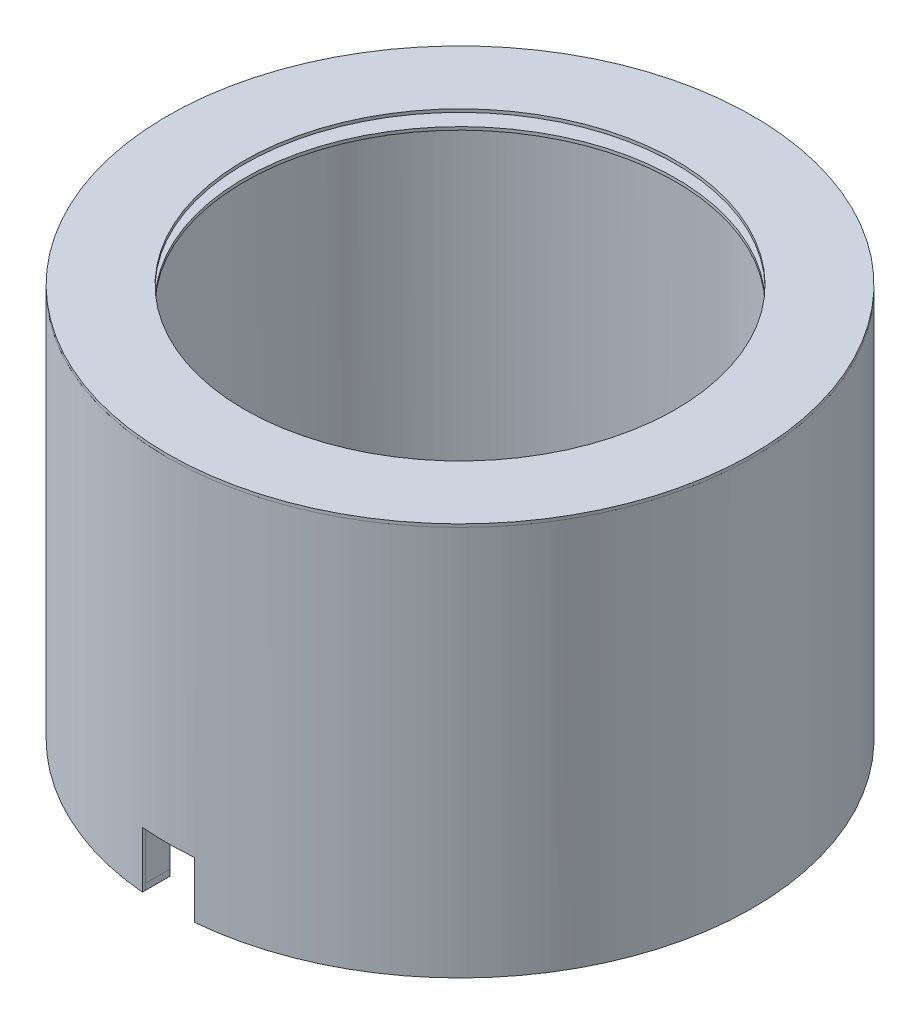
ISO-10303-21;
HEADER;
FILE_DESCRIPTION(('STEP AP214'),'2;1');
FILE_NAME('part.step','',(''),(''),'','','');
FILE_SCHEMA(('AUTOMOTIVE_DESIGN { 1 0 10303 214 1 1 1 1 }'));
ENDSEC;
DATA;
#1=APPLICATION_CONTEXT('core data for automotive mechanical design processes');
#2=APPLICATION_PROTOCOL_DEFINITION('international standard','automotive_design',2000,#1);
#3=PRODUCT_CONTEXT('',#1,'mechanical');
#4=PRODUCT('Part','Part','',(#3));
#5=PRODUCT_RELATED_PRODUCT_CATEGORY('part','',(#4));
#6=PRODUCT_DEFINITION_FORMATION('','',#4);
#7=PRODUCT_DEFINITION_CONTEXT('part definition',#1,'design');
#8=PRODUCT_DEFINITION('design','',#6,#7);
#9=PRODUCT_DEFINITION_SHAPE('','',#8);
#10=(LENGTH_UNIT() NAMED_UNIT(*) SI_UNIT(.MILLI.,.METRE.));
#11=(NAMED_UNIT(*) PLANE_ANGLE_UNIT() SI_UNIT($,.RADIAN.));
#12=(NAMED_UNIT(*) SI_UNIT($,.STERADIAN.) SOLID_ANGLE_UNIT());
#13=UNCERTAINTY_MEASURE_WITH_UNIT(LENGTH_MEASURE(1.E-05),#10,'distance_accuracy_value','');
#14=(GEOMETRIC_REPRESENTATION_CONTEXT(3) GLOBAL_UNCERTAINTY_ASSIGNED_CONTEXT((#13)) GLOBAL_UNIT_ASSIGNED_CONTEXT((#10,
#11,#12)) REPRESENTATION_CONTEXT('',''));
#15=CARTESIAN_POINT('',(0.,0.,0.));
#16=DIRECTION('',(0.,0.,1.));
#17=DIRECTION('',(1.,0.,0.));
#18=AXIS2_PLACEMENT_3D('',#15,#16,#17);
#19=CARTESIAN_POINT('',(0.,968.780374315355,0.));
#20=DIRECTION('',(0.,-1.,0.));
#21=DIRECTION('',(0.,0.,-1.));
#22=AXIS2_PLACEMENT_3D('',#19,#20,#21);
#23=CYLINDRICAL_SURFACE('',#22,235.);
#24=CARTESIAN_POINT('',(0.,5.,0.));
#25=DIRECTION('',(0.,1.,0.));
#26=DIRECTION('',(0.,0.,1.));
#27=AXIS2_PLACEMENT_3D('',#24,#25,#26);
#28=CIRCLE('',#27,235.);
#29=CARTESIAN_POINT('',(21.250000045,5.,234.037256645363));
#30=VERTEX_POINT('',#29);
#31=CARTESIAN_POINT('',(-21.250000045,5.,234.037256645363));
#32=VERTEX_POINT('',#31);
#33=EDGE_CURVE('E133',#30,#32,#28,.T.);
#34=ORIENTED_EDGE('',*,*,#33,.T.);
#35=DIRECTION('',(0.,-1.,0.));
#36=VECTOR('',#35,1.);
#37=CARTESIAN_POINT('',(-21.2500000449994,968.780374315355,234.037256645363));
#38=LINE('',#37,#36);
#39=CARTESIAN_POINT('',(-21.250000045,45.6000000659999,234.037256645363));
#40=VERTEX_POINT('',#39);
#41=EDGE_CURVE('E74',#32,#40,#38,.F.);
#42=ORIENTED_EDGE('',*,*,#41,.T.);
#43=CARTESIAN_POINT('',(0.,45.600000066,0.));
#44=DIRECTION('',(0.,1.,0.));
#45=DIRECTION('',(-1.,0.,0.));
#46=AXIS2_PLACEMENT_3D('',#43,#44,#45);
#47=CIRCLE('',#46,235.);
#48=CARTESIAN_POINT('',(21.250000045,45.600000066,234.037256645363));
#49=VERTEX_POINT('',#48);
#50=EDGE_CURVE('E106',#40,#49,#47,.T.);
#51=ORIENTED_EDGE('',*,*,#50,.T.);
#52=DIRECTION('',(0.,-1.,0.));
#53=VECTOR('',#52,1.);
#54=CARTESIAN_POINT('',(21.2500000449997,968.780374315355,234.037256645363));
#55=LINE('',#54,#53);
#56=EDGE_CURVE('E122',#49,#30,#55,.T.);
#57=ORIENTED_EDGE('',*,*,#56,.T.);
#58=EDGE_LOOP('',(#34,#42,#51,#57));
#59=FACE_BOUND('',#58,.T.);
#60=CARTESIAN_POINT('',(0.,304.1,0.));
#61=DIRECTION('',(0.,1.,0.));
#62=DIRECTION('',(0.,0.,1.));
#63=AXIS2_PLACEMENT_3D('',#60,#61,#62);
#64=CIRCLE('',#63,235.);
#65=CARTESIAN_POINT('',(0.,304.1,235.));
#66=VERTEX_POINT('',#65);
#67=EDGE_CURVE('E60',#66,#66,#64,.T.);
#68=ORIENTED_EDGE('',*,*,#67,.F.);
#69=EDGE_LOOP('',(#68));
#70=FACE_BOUND('',#69,.T.);
#71=ADVANCED_FACE('F46',(#59,#70),#23,.T.);
#72=CARTESIAN_POINT('',(0.,5.,0.));
#73=DIRECTION('',(0.,1.,0.));
#74=DIRECTION('',(0.,0.,1.));
#75=AXIS2_PLACEMENT_3D('',#72,#73,#74);
#76=PLANE('',#75);
#77=CARTESIAN_POINT('',(0.,5.,0.));
#78=DIRECTION('',(0.,-1.,0.));
#79=DIRECTION('',(0.,0.,-1.));
#80=AXIS2_PLACEMENT_3D('',#77,#78,#79);
#81=CIRCLE('',#80,215.);
#82=CARTESIAN_POINT('',(-21.250000045,5.00000000000003,213.947277379469));
#83=VERTEX_POINT('',#82);
#84=CARTESIAN_POINT('',(21.250000045,5.00000000000001,213.947277379469));
#85=VERTEX_POINT('',#84);
#86=EDGE_CURVE('E131',#83,#85,#81,.T.);
#87=ORIENTED_EDGE('',*,*,#86,.F.);
#88=DIRECTION('',(0.,0.,1.));
#89=VECTOR('',#88,1.);
#90=CARTESIAN_POINT('',(-21.250000045,5.,0.));
#91=LINE('',#90,#89);
#92=EDGE_CURVE('E95',#83,#32,#91,.T.);
#93=ORIENTED_EDGE('',*,*,#92,.T.);
#94=ORIENTED_EDGE('',*,*,#33,.F.);
#95=DIRECTION('',(0.,0.,-1.));
#96=VECTOR('',#95,1.);
#97=CARTESIAN_POINT('',(21.250000045,5.,0.));
#98=LINE('',#97,#96);
#99=EDGE_CURVE('E119',#30,#85,#98,.T.);
#100=ORIENTED_EDGE('',*,*,#99,.T.);
#101=EDGE_LOOP('',(#87,#93,#94,#100));
#102=FACE_BOUND('',#101,.T.);
#103=ADVANCED_FACE('F140',(#102),#76,.F.);
#104=CARTESIAN_POINT('',(0.,304.1,0.));
#105=DIRECTION('',(0.,1.,0.));
#106=DIRECTION('',(0.,0.,1.));
#107=AXIS2_PLACEMENT_3D('',#104,#105,#106);
#108=PLANE('',#107);
#109=CARTESIAN_POINT('',(0.,304.1,0.));
#110=DIRECTION('',(0.,-1.,0.));
#111=DIRECTION('',(0.,0.,-1.));
#112=AXIS2_PLACEMENT_3D('',#109,#110,#111);
#113=CIRCLE('',#112,220.);
#114=CARTESIAN_POINT('',(0.,304.1,-220.));
#115=VERTEX_POINT('',#114);
#116=EDGE_CURVE('E128',#115,#115,#113,.T.);
#117=ORIENTED_EDGE('',*,*,#116,.T.);
#118=EDGE_LOOP('',(#117));
#119=FACE_BOUND('',#118,.T.);
#120=ORIENTED_EDGE('',*,*,#67,.T.);
#121=EDGE_LOOP('',(#120));
#122=FACE_BOUND('',#121,.T.);
#123=ADVANCED_FACE('F48',(#119,#122),#108,.T.);
#124=CARTESIAN_POINT('',(0.,304.1,0.));
#125=DIRECTION('',(0.,1.,0.));
#126=DIRECTION('',(0.,0.,1.));
#127=AXIS2_PLACEMENT_3D('',#124,#125,#126);
#128=CONICAL_SURFACE('',#127,220.,0.016715260196546);
#129=CARTESIAN_POINT('',(-21.2500000449998,445.628641091364,221.348220505904));
#130=CARTESIAN_POINT('',(-21.2500000449998,304.483118284769,218.977893048402));
#131=CARTESIAN_POINT('',(-21.2500000449999,163.337601925984,216.607181768569));
#132=CARTESIAN_POINT('',(-21.2500000450001,-118.95341789604,211.864991564241));
#133=CARTESIAN_POINT('',(-21.2500000450002,-260.098921359278,209.493512639747));
#134=CARTESIAN_POINT('',(-21.2500000450003,-401.244418374707,207.121649892922));
#135=B_SPLINE_CURVE_WITH_KNOTS('',3,(#129,#130,#131,#132,#133,#134),.UNSPECIFIED.,.F.,.F.,(4,2,
4),(0.,423.496273350127,846.992546700462),.UNSPECIFIED.);
#136=CARTESIAN_POINT('',(-21.250000045,45.6000000659999,214.629309110537));
#137=VERTEX_POINT('',#136);
#138=EDGE_CURVE('E91',#137,#83,#135,.T.);
#139=ORIENTED_EDGE('',*,*,#138,.T.);
#140=ORIENTED_EDGE('',*,*,#86,.T.);
#141=CARTESIAN_POINT('',(21.250000045,86.6613655986411,215.319069835236));
#142=CARTESIAN_POINT('',(21.250000045,66.2075768064492,214.975486562565));
#143=CARTESIAN_POINT('',(21.250000045,45.7537881494131,214.631895244339));
#144=CARTESIAN_POINT('',(21.250000045,4.84621110565232,213.944696516776));
#145=CARTESIAN_POINT('',(21.250000045,-15.6075772810723,213.601089107439));
#146=CARTESIAN_POINT('',(21.250000045,-36.0613655326411,213.257473652548));
#147=B_SPLINE_CURVE_WITH_KNOTS('',3,(#141,#142,#143,#144,#145,#146),.UNSPECIFIED.,.F.,.F.,(4,2,
4),(0.,61.3700230469726,122.740046093945),.UNSPECIFIED.);
#148=CARTESIAN_POINT('',(21.250000045,45.600000066,214.629309110537));
#149=VERTEX_POINT('',#148);
#150=EDGE_CURVE('E12',#149,#85,#147,.T.);
#151=ORIENTED_EDGE('',*,*,#150,.F.);
#152=CARTESIAN_POINT('',(4.19104732413992E-13,45.600000066,0.));
#153=DIRECTION('',(0.,1.,0.));
#154=DIRECTION('',(-1.,0.,0.));
#155=AXIS2_PLACEMENT_3D('',#152,#153,#154);
#156=CIRCLE('',#155,215.678702776095);
#157=EDGE_CURVE('E100',#149,#137,#156,.F.);
#158=ORIENTED_EDGE('',*,*,#157,.T.);
#159=EDGE_LOOP('',(#139,#140,#151,#158));
#160=FACE_BOUND('',#159,.T.);
#161=ORIENTED_EDGE('',*,*,#116,.F.);
#162=EDGE_LOOP('',(#161));
#163=FACE_BOUND('',#162,.T.);
#164=ADVANCED_FACE('F108',(#160,#163),#128,.F.);
#165=CARTESIAN_POINT('',(-21.250000045,45.600000066,-237.501));
#166=DIRECTION('',(-1.,0.,0.));
#167=DIRECTION('',(0.,-1.,0.));
#168=AXIS2_PLACEMENT_3D('',#165,#166,#167);
#169=PLANE('',#168);
#170=ORIENTED_EDGE('',*,*,#92,.F.);
#171=ORIENTED_EDGE('',*,*,#138,.F.);
#172=DIRECTION('',(0.,0.,1.));
#173=VECTOR('',#172,1.);
#174=CARTESIAN_POINT('',(-21.250000045,45.600000066,-237.501));
#175=LINE('',#174,#173);
#176=EDGE_CURVE('E94',#137,#40,#175,.T.);
#177=ORIENTED_EDGE('',*,*,#176,.T.);
#178=ORIENTED_EDGE('',*,*,#41,.F.);
#179=EDGE_LOOP('',(#170,#171,#177,#178));
#180=FACE_BOUND('',#179,.T.);
#181=ADVANCED_FACE('F93',(#180),#169,.F.);
#182=CARTESIAN_POINT('',(-21.250000045,45.600000066,-237.501));
#183=DIRECTION('',(0.,1.,0.));
#184=DIRECTION('',(-1.,0.,0.));
#185=AXIS2_PLACEMENT_3D('',#182,#183,#184);
#186=PLANE('',#185);
#187=ORIENTED_EDGE('',*,*,#176,.F.);
#188=ORIENTED_EDGE('',*,*,#157,.F.);
#189=DIRECTION('',(0.,0.,1.));
#190=VECTOR('',#189,1.);
#191=CARTESIAN_POINT('',(21.250000045,45.600000066,-237.501));
#192=LINE('',#191,#190);
#193=EDGE_CURVE('E66',#149,#49,#192,.T.);
#194=ORIENTED_EDGE('',*,*,#193,.T.);
#195=ORIENTED_EDGE('',*,*,#50,.F.);
#196=EDGE_LOOP('',(#187,#188,#194,#195));
#197=FACE_BOUND('',#196,.T.);
#198=ADVANCED_FACE('F103',(#197),#186,.F.);
#199=CARTESIAN_POINT('',(21.250000045,45.600000066,-237.501));
#200=DIRECTION('',(1.,0.,0.));
#201=DIRECTION('',(0.,1.,0.));
#202=AXIS2_PLACEMENT_3D('',#199,#200,#201);
#203=PLANE('',#202);
#204=ORIENTED_EDGE('',*,*,#193,.F.);
#205=ORIENTED_EDGE('',*,*,#150,.T.);
#206=ORIENTED_EDGE('',*,*,#99,.F.);
#207=ORIENTED_EDGE('',*,*,#56,.F.);
#208=EDGE_LOOP('',(#204,#205,#206,#207));
#209=FACE_BOUND('',#208,.T.);
#210=ADVANCED_FACE('F154',(#209),#203,.F.);
#211=CLOSED_SHELL('',(#71,#103,#123,#164,#181,#198,#210));
#212=MANIFOLD_SOLID_BREP('B2',#211);
#213=CARTESIAN_POINT('',(0.,304.1,0.));
#214=DIRECTION('',(0.,1.,0.));
#215=DIRECTION('',(0.,0.,1.));
#216=AXIS2_PLACEMENT_3D('',#213,#214,#215);
#217=CYLINDRICAL_SURFACE('',#216,235.);
#218=CARTESIAN_POINT('',(0.,304.1,0.));
#219=DIRECTION('',(0.,1.,0.));
#220=DIRECTION('',(0.,0.,1.));
#221=AXIS2_PLACEMENT_3D('',#218,#219,#220);
#222=CIRCLE('',#221,235.);
#223=CARTESIAN_POINT('',(0.,304.1,235.));
#224=VERTEX_POINT('',#223);
#225=EDGE_CURVE('E45',#224,#224,#222,.T.);
#226=ORIENTED_EDGE('',*,*,#225,.T.);
#227=EDGE_LOOP('',(#226));
#228=FACE_BOUND('',#227,.T.);
#229=CARTESIAN_POINT('',(0.,306.6,0.));
#230=DIRECTION('',(0.,1.,0.));
#231=DIRECTION('',(0.,0.,1.));
#232=AXIS2_PLACEMENT_3D('',#229,#230,#231);
#233=CIRCLE('',#232,235.);
#234=CARTESIAN_POINT('',(0.,306.6,235.));
#235=VERTEX_POINT('',#234);
#236=EDGE_CURVE('E215',#235,#235,#233,.T.);
#237=ORIENTED_EDGE('',*,*,#236,.F.);
#238=EDGE_LOOP('',(#237));
#239=FACE_BOUND('',#238,.T.);
#240=ADVANCED_FACE('F212',(#228,#239),#217,.T.);
#241=CARTESIAN_POINT('',(0.,304.1,0.));
#242=DIRECTION('',(0.,1.,0.));
#243=DIRECTION('',(0.,0.,1.));
#244=AXIS2_PLACEMENT_3D('',#241,#242,#243);
#245=PLANE('',#244);
#246=CARTESIAN_POINT('',(0.,304.1,0.));
#247=DIRECTION('',(0.,1.,0.));
#248=DIRECTION('',(0.,0.,1.));
#249=AXIS2_PLACEMENT_3D('',#246,#247,#248);
#250=CIRCLE('',#249,175.);
#251=CARTESIAN_POINT('',(0.,304.1,175.));
#252=VERTEX_POINT('',#251);
#253=EDGE_CURVE('E222',#252,#252,#250,.T.);
#254=ORIENTED_EDGE('',*,*,#253,.T.);
#255=EDGE_LOOP('',(#254));
#256=FACE_BOUND('',#255,.T.);
#257=ORIENTED_EDGE('',*,*,#225,.F.);
#258=EDGE_LOOP('',(#257));
#259=FACE_BOUND('',#258,.T.);
#260=ADVANCED_FACE('F230',(#256,#259),#245,.F.);
#261=CARTESIAN_POINT('',(0.,306.6,0.));
#262=DIRECTION('',(0.,1.,0.));
#263=DIRECTION('',(0.,0.,1.));
#264=AXIS2_PLACEMENT_3D('',#261,#262,#263);
#265=PLANE('',#264);
#266=CARTESIAN_POINT('',(0.,306.6,0.));
#267=DIRECTION('',(0.,1.,0.));
#268=DIRECTION('',(0.,0.,1.));
#269=AXIS2_PLACEMENT_3D('',#266,#267,#268);
#270=CIRCLE('',#269,175.);
#271=CARTESIAN_POINT('',(0.,306.6,175.));
#272=VERTEX_POINT('',#271);
#273=EDGE_CURVE('E224',#272,#272,#270,.T.);
#274=ORIENTED_EDGE('',*,*,#273,.F.);
#275=EDGE_LOOP('',(#274));
#276=FACE_BOUND('',#275,.T.);
#277=ORIENTED_EDGE('',*,*,#236,.T.);
#278=EDGE_LOOP('',(#277));
#279=FACE_BOUND('',#278,.T.);
#280=ADVANCED_FACE('F236',(#276,#279),#265,.T.);
#281=CARTESIAN_POINT('',(0.,304.1,0.));
#282=DIRECTION('',(0.,1.,0.));
#283=DIRECTION('',(0.,0.,1.));
#284=AXIS2_PLACEMENT_3D('',#281,#282,#283);
#285=CYLINDRICAL_SURFACE('',#284,175.);
#286=ORIENTED_EDGE('',*,*,#253,.F.);
#287=EDGE_LOOP('',(#286));
#288=FACE_BOUND('',#287,.T.);
#289=ORIENTED_EDGE('',*,*,#273,.T.);
#290=EDGE_LOOP('',(#289));
#291=FACE_BOUND('',#290,.T.);
#292=ADVANCED_FACE('F233',(#288,#291),#285,.F.);
#293=CLOSED_SHELL('',(#240,#260,#280,#292));
#294=MANIFOLD_SOLID_BREP('B6',#293);
#295=CARTESIAN_POINT('',(0.,319.1,0.));
#296=DIRECTION('',(0.,1.,0.));
#297=DIRECTION('',(0.,0.,1.));
#298=AXIS2_PLACEMENT_3D('',#295,#296,#297);
#299=PLANE('',#298);
#300=CARTESIAN_POINT('',(0.,319.1,0.));
#301=DIRECTION('',(0.,1.,0.));
#302=DIRECTION('',(0.,0.,1.));
#303=AXIS2_PLACEMENT_3D('',#300,#301,#302);
#304=CIRCLE('',#303,237.5);
#305=CARTESIAN_POINT('',(0.,319.1,237.5));
#306=VERTEX_POINT('',#305);
#307=EDGE_CURVE('E211',#306,#306,#304,.T.);
#308=ORIENTED_EDGE('',*,*,#307,.T.);
#309=EDGE_LOOP('',(#308));
#310=FACE_BOUND('',#309,.T.);
#311=CARTESIAN_POINT('',(0.,319.1,0.));
#312=DIRECTION('',(0.,1.,0.));
#313=DIRECTION('',(0.,0.,1.));
#314=AXIS2_PLACEMENT_3D('',#311,#312,#313);
#315=CIRCLE('',#314,175.);
#316=CARTESIAN_POINT('',(0.,319.1,175.));
#317=VERTEX_POINT('',#316);
#318=EDGE_CURVE('E295',#317,#317,#315,.T.);
#319=ORIENTED_EDGE('',*,*,#318,.F.);
#320=EDGE_LOOP('',(#319));
#321=FACE_BOUND('',#320,.T.);
#322=ADVANCED_FACE('F284',(#310,#321),#299,.T.);
#323=CARTESIAN_POINT('',(0.,316.6,0.));
#324=DIRECTION('',(0.,1.,0.));
#325=DIRECTION('',(0.,0.,1.));
#326=AXIS2_PLACEMENT_3D('',#323,#324,#325);
#327=PLANE('',#326);
#328=CARTESIAN_POINT('',(0.,316.6,0.));
#329=DIRECTION('',(0.,1.,0.));
#330=DIRECTION('',(0.,0.,1.));
#331=AXIS2_PLACEMENT_3D('',#328,#329,#330);
#332=CIRCLE('',#331,237.5);
#333=CARTESIAN_POINT('',(0.,316.6,237.5));
#334=VERTEX_POINT('',#333);
#335=EDGE_CURVE('E288',#334,#334,#332,.T.);
#336=ORIENTED_EDGE('',*,*,#335,.F.);
#337=EDGE_LOOP('',(#336));
#338=FACE_BOUND('',#337,.T.);
#339=CARTESIAN_POINT('',(0.,316.6,0.));
#340=DIRECTION('',(0.,1.,0.));
#341=DIRECTION('',(0.,0.,1.));
#342=AXIS2_PLACEMENT_3D('',#339,#340,#341);
#343=CIRCLE('',#342,175.);
#344=CARTESIAN_POINT('',(0.,316.6,175.));
#345=VERTEX_POINT('',#344);
#346=EDGE_CURVE('E297',#345,#345,#343,.T.);
#347=ORIENTED_EDGE('',*,*,#346,.T.);
#348=EDGE_LOOP('',(#347));
#349=FACE_BOUND('',#348,.T.);
#350=ADVANCED_FACE('F307',(#338,#349),#327,.F.);
#351=CARTESIAN_POINT('',(0.,319.1,0.));
#352=DIRECTION('',(0.,-1.,0.));
#353=DIRECTION('',(0.,0.,-1.));
#354=AXIS2_PLACEMENT_3D('',#351,#352,#353);
#355=CYLINDRICAL_SURFACE('',#354,237.5);
#356=ORIENTED_EDGE('',*,*,#307,.F.);
#357=EDGE_LOOP('',(#356));
#358=FACE_BOUND('',#357,.T.);
#359=ORIENTED_EDGE('',*,*,#335,.T.);
#360=EDGE_LOOP('',(#359));
#361=FACE_BOUND('',#360,.T.);
#362=ADVANCED_FACE('F286',(#358,#361),#355,.T.);
#363=CARTESIAN_POINT('',(0.,319.1,0.));
#364=DIRECTION('',(0.,-1.,0.));
#365=DIRECTION('',(0.,0.,-1.));
#366=AXIS2_PLACEMENT_3D('',#363,#364,#365);
#367=CYLINDRICAL_SURFACE('',#366,175.);
#368=ORIENTED_EDGE('',*,*,#318,.T.);
#369=EDGE_LOOP('',(#368));
#370=FACE_BOUND('',#369,.T.);
#371=ORIENTED_EDGE('',*,*,#346,.F.);
#372=EDGE_LOOP('',(#371));
#373=FACE_BOUND('',#372,.T.);
#374=ADVANCED_FACE('F303',(#370,#373),#367,.F.);
#375=CLOSED_SHELL('',(#322,#350,#362,#374));
#376=MANIFOLD_SOLID_BREP('B40',#375);
#377=CARTESIAN_POINT('',(0.,5.,0.));
#378=DIRECTION('',(0.,1.,0.));
#379=DIRECTION('',(0.,0.,1.));
#380=AXIS2_PLACEMENT_3D('',#377,#378,#379);
#381=PLANE('',#380);
#382=DIRECTION('',(0.,0.,1.));
#383=VECTOR('',#382,1.);
#384=CARTESIAN_POINT('',(-21.250000045,5.,0.));
#385=LINE('',#384,#383);
#386=CARTESIAN_POINT('',(-21.250000045,5.,213.947277379469));
#387=VERTEX_POINT('',#386);
#388=CARTESIAN_POINT('',(-21.250000045,5.,234.037256645363));
#389=VERTEX_POINT('',#388);
#390=EDGE_CURVE('E394',#387,#389,#385,.T.);
#391=ORIENTED_EDGE('',*,*,#390,.F.);
#392=CARTESIAN_POINT('',(0.,5.,0.));
#393=DIRECTION('',(0.,1.,0.));
#394=DIRECTION('',(0.,0.,1.));
#395=AXIS2_PLACEMENT_3D('',#392,#393,#394);
#396=CIRCLE('',#395,215.);
#397=CARTESIAN_POINT('',(21.250000045,5.,213.947277379469));
#398=VERTEX_POINT('',#397);
#399=EDGE_CURVE('E403',#398,#387,#396,.T.);
#400=ORIENTED_EDGE('',*,*,#399,.F.);
#401=DIRECTION('',(0.,0.,-1.));
#402=VECTOR('',#401,1.);
#403=CARTESIAN_POINT('',(21.250000045,5.,0.));
#404=LINE('',#403,#402);
#405=CARTESIAN_POINT('',(21.250000045,5.,234.037256645363));
#406=VERTEX_POINT('',#405);
#407=EDGE_CURVE('E377',#406,#398,#404,.T.);
#408=ORIENTED_EDGE('',*,*,#407,.F.);
#409=CARTESIAN_POINT('',(0.,5.,0.));
#410=DIRECTION('',(0.,1.,0.));
#411=DIRECTION('',(0.,0.,1.));
#412=AXIS2_PLACEMENT_3D('',#409,#410,#411);
#413=CIRCLE('',#412,235.);
#414=EDGE_CURVE('E405',#406,#389,#413,.T.);
#415=ORIENTED_EDGE('',*,*,#414,.T.);
#416=EDGE_LOOP('',(#391,#400,#408,#415));
#417=FACE_BOUND('',#416,.T.);
#418=ADVANCED_FACE('F355',(#417),#381,.T.);
#419=CARTESIAN_POINT('',(0.,0.,0.));
#420=DIRECTION('',(0.,1.,0.));
#421=DIRECTION('',(0.,0.,1.));
#422=AXIS2_PLACEMENT_3D('',#419,#420,#421);
#423=PLANE('',#422);
#424=CARTESIAN_POINT('',(0.,0.,0.));
#425=DIRECTION('',(0.,1.,0.));
#426=DIRECTION('',(0.,0.,1.));
#427=AXIS2_PLACEMENT_3D('',#424,#425,#426);
#428=CIRCLE('',#427,215.);
#429=CARTESIAN_POINT('',(21.250000045,0.,213.947277379469));
#430=VERTEX_POINT('',#429);
#431=CARTESIAN_POINT('',(-21.250000045,0.,213.947277379469));
#432=VERTEX_POINT('',#431);
#433=EDGE_CURVE('E411',#430,#432,#428,.T.);
#434=ORIENTED_EDGE('',*,*,#433,.T.);
#435=DIRECTION('',(0.,0.,1.));
#436=VECTOR('',#435,1.);
#437=CARTESIAN_POINT('',(-21.250000045,0.,-237.501));
#438=LINE('',#437,#436);
#439=CARTESIAN_POINT('',(-21.250000045,0.,234.037256645363));
#440=VERTEX_POINT('',#439);
#441=EDGE_CURVE('E369',#432,#440,#438,.T.);
#442=ORIENTED_EDGE('',*,*,#441,.T.);
#443=CARTESIAN_POINT('',(0.,0.,0.));
#444=DIRECTION('',(0.,1.,0.));
#445=DIRECTION('',(0.,0.,1.));
#446=AXIS2_PLACEMENT_3D('',#443,#444,#445);
#447=CIRCLE('',#446,235.);
#448=CARTESIAN_POINT('',(21.250000045,0.,234.037256645363));
#449=VERTEX_POINT('',#448);
#450=EDGE_CURVE('E410',#449,#440,#447,.T.);
#451=ORIENTED_EDGE('',*,*,#450,.F.);
#452=DIRECTION('',(0.,0.,1.));
#453=VECTOR('',#452,1.);
#454=CARTESIAN_POINT('',(21.250000045,0.,-237.501));
#455=LINE('',#454,#453);
#456=EDGE_CURVE('E420',#430,#449,#455,.T.);
#457=ORIENTED_EDGE('',*,*,#456,.F.);
#458=EDGE_LOOP('',(#434,#442,#451,#457));
#459=FACE_BOUND('',#458,.T.);
#460=ADVANCED_FACE('F424',(#459),#423,.F.);
#461=CARTESIAN_POINT('',(0.,5.,0.));
#462=DIRECTION('',(0.,-1.,0.));
#463=DIRECTION('',(0.,0.,-1.));
#464=AXIS2_PLACEMENT_3D('',#461,#462,#463);
#465=CYLINDRICAL_SURFACE('',#464,235.);
#466=ORIENTED_EDGE('',*,*,#450,.T.);
#467=DIRECTION('',(0.,-1.,0.));
#468=VECTOR('',#467,1.);
#469=CARTESIAN_POINT('',(-21.250000045,5.00000000000001,234.037256645363));
#470=LINE('',#469,#468);
#471=EDGE_CURVE('E406',#440,#389,#470,.F.);
#472=ORIENTED_EDGE('',*,*,#471,.T.);
#473=ORIENTED_EDGE('',*,*,#414,.F.);
#474=DIRECTION('',(0.,-1.,0.));
#475=VECTOR('',#474,1.);
#476=CARTESIAN_POINT('',(21.250000045,5.00000000000001,234.037256645363));
#477=LINE('',#476,#475);
#478=EDGE_CURVE('E407',#406,#449,#477,.T.);
#479=ORIENTED_EDGE('',*,*,#478,.T.);
#480=EDGE_LOOP('',(#466,#472,#473,#479));
#481=FACE_BOUND('',#480,.T.);
#482=ADVANCED_FACE('F357',(#481),#465,.T.);
#483=CARTESIAN_POINT('',(0.,5.,0.));
#484=DIRECTION('',(0.,-1.,0.));
#485=DIRECTION('',(0.,0.,-1.));
#486=AXIS2_PLACEMENT_3D('',#483,#484,#485);
#487=CYLINDRICAL_SURFACE('',#486,215.);
#488=DIRECTION('',(0.,-1.,0.));
#489=VECTOR('',#488,1.);
#490=CARTESIAN_POINT('',(-21.250000045,5.00000000000001,213.947277379469));
#491=LINE('',#490,#489);
#492=EDGE_CURVE('E282',#432,#387,#491,.F.);
#493=ORIENTED_EDGE('',*,*,#492,.F.);
#494=ORIENTED_EDGE('',*,*,#433,.F.);
#495=DIRECTION('',(0.,-1.,0.));
#496=VECTOR('',#495,1.);
#497=CARTESIAN_POINT('',(21.250000045,5.00000000000001,213.947277379469));
#498=LINE('',#497,#496);
#499=EDGE_CURVE('E363',#398,#430,#498,.T.);
#500=ORIENTED_EDGE('',*,*,#499,.F.);
#501=ORIENTED_EDGE('',*,*,#399,.T.);
#502=EDGE_LOOP('',(#493,#494,#500,#501));
#503=FACE_BOUND('',#502,.T.);
#504=ADVANCED_FACE('F409',(#503),#487,.F.);
#505=CARTESIAN_POINT('',(21.250000045,45.600000066,-237.501));
#506=DIRECTION('',(1.,0.,0.));
#507=DIRECTION('',(0.,1.,0.));
#508=AXIS2_PLACEMENT_3D('',#505,#506,#507);
#509=PLANE('',#508);
#510=ORIENTED_EDGE('',*,*,#407,.T.);
#511=ORIENTED_EDGE('',*,*,#499,.T.);
#512=ORIENTED_EDGE('',*,*,#456,.T.);
#513=ORIENTED_EDGE('',*,*,#478,.F.);
#514=EDGE_LOOP('',(#510,#511,#512,#513));
#515=FACE_BOUND('',#514,.T.);
#516=ADVANCED_FACE('F419',(#515),#509,.F.);
#517=CARTESIAN_POINT('',(-21.250000045,45.600000066,-237.501));
#518=DIRECTION('',(-1.,0.,0.));
#519=DIRECTION('',(0.,-1.,0.));
#520=AXIS2_PLACEMENT_3D('',#517,#518,#519);
#521=PLANE('',#520);
#522=ORIENTED_EDGE('',*,*,#441,.F.);
#523=ORIENTED_EDGE('',*,*,#492,.T.);
#524=ORIENTED_EDGE('',*,*,#390,.T.);
#525=ORIENTED_EDGE('',*,*,#471,.F.);
#526=EDGE_LOOP('',(#522,#523,#524,#525));
#527=FACE_BOUND('',#526,.T.);
#528=ADVANCED_FACE('F393',(#527),#521,.F.);
#529=CLOSED_SHELL('',(#418,#460,#482,#504,#516,#528));
#530=MANIFOLD_SOLID_BREP('B206',#529);
#531=CARTESIAN_POINT('',(0.,316.6,0.));
#532=DIRECTION('',(0.,1.,0.));
#533=DIRECTION('',(0.,0.,1.));
#534=AXIS2_PLACEMENT_3D('',#531,#532,#533);
#535=PLANE('',#534);
#536=CARTESIAN_POINT('',(0.,316.6,0.));
#537=DIRECTION('',(0.,1.,0.));
#538=DIRECTION('',(0.,0.,1.));
#539=AXIS2_PLACEMENT_3D('',#536,#537,#538);
#540=CIRCLE('',#539,237.5);
#541=CARTESIAN_POINT('',(0.,316.6,237.5));
#542=VERTEX_POINT('',#541);
#543=EDGE_CURVE('E547',#542,#542,#540,.T.);
#544=ORIENTED_EDGE('',*,*,#543,.T.);
#545=EDGE_LOOP('',(#544));
#546=FACE_BOUND('',#545,.T.);
#547=CARTESIAN_POINT('',(0.,316.6,0.));
#548=DIRECTION('',(0.,1.,0.));
#549=DIRECTION('',(0.,0.,1.));
#550=AXIS2_PLACEMENT_3D('',#547,#548,#549);
#551=CIRCLE('',#550,235.);
#552=CARTESIAN_POINT('',(0.,316.6,235.));
#553=VERTEX_POINT('',#552);
#554=EDGE_CURVE('E540',#553,#553,#551,.T.);
#555=ORIENTED_EDGE('',*,*,#554,.F.);
#556=EDGE_LOOP('',(#555));
#557=FACE_BOUND('',#556,.T.);
#558=ADVANCED_FACE('F479',(#546,#557),#535,.T.);
#559=CARTESIAN_POINT('',(0.,0.,0.));
#560=DIRECTION('',(0.,1.,0.));
#561=DIRECTION('',(0.,0.,1.));
#562=AXIS2_PLACEMENT_3D('',#559,#560,#561);
#563=PLANE('',#562);
#564=CARTESIAN_POINT('',(0.,0.,0.));
#565=DIRECTION('',(0.,1.,0.));
#566=DIRECTION('',(0.,0.,1.));
#567=AXIS2_PLACEMENT_3D('',#564,#565,#566);
#568=CIRCLE('',#567,235.);
#569=CARTESIAN_POINT('',(21.250000045,0.,234.037256645363));
#570=VERTEX_POINT('',#569);
#571=CARTESIAN_POINT('',(-21.250000045,0.,234.037256645363));
#572=VERTEX_POINT('',#571);
#573=EDGE_CURVE('E536',#570,#572,#568,.T.);
#574=ORIENTED_EDGE('',*,*,#573,.T.);
#575=DIRECTION('',(0.,0.,1.));
#576=VECTOR('',#575,1.);
#577=CARTESIAN_POINT('',(-21.250000045,0.,-237.501));
#578=LINE('',#577,#576);
#579=CARTESIAN_POINT('',(-21.250000045,0.,236.54743181461));
#580=VERTEX_POINT('',#579);
#581=EDGE_CURVE('E519',#572,#580,#578,.T.);
#582=ORIENTED_EDGE('',*,*,#581,.T.);
#583=CARTESIAN_POINT('',(0.,0.,0.));
#584=DIRECTION('',(0.,1.,0.));
#585=DIRECTION('',(0.,0.,1.));
#586=AXIS2_PLACEMENT_3D('',#583,#584,#585);
#587=CIRCLE('',#586,237.5);
#588=CARTESIAN_POINT('',(21.250000045,0.,236.54743181461));
#589=VERTEX_POINT('',#588);
#590=EDGE_CURVE('E543',#589,#580,#587,.T.);
#591=ORIENTED_EDGE('',*,*,#590,.F.);
#592=DIRECTION('',(0.,0.,1.));
#593=VECTOR('',#592,1.);
#594=CARTESIAN_POINT('',(21.250000045,0.,-237.501));
#595=LINE('',#594,#593);
#596=EDGE_CURVE('E539',#570,#589,#595,.T.);
#597=ORIENTED_EDGE('',*,*,#596,.F.);
#598=EDGE_LOOP('',(#574,#582,#591,#597));
#599=FACE_BOUND('',#598,.T.);
#600=ADVANCED_FACE('F538',(#599),#563,.F.);
#601=CARTESIAN_POINT('',(0.,316.6,0.));
#602=DIRECTION('',(0.,-1.,0.));
#603=DIRECTION('',(0.,0.,-1.));
#604=AXIS2_PLACEMENT_3D('',#601,#602,#603);
#605=CYLINDRICAL_SURFACE('',#604,237.5);
#606=ORIENTED_EDGE('',*,*,#543,.F.);
#607=EDGE_LOOP('',(#606));
#608=FACE_BOUND('',#607,.T.);
#609=ORIENTED_EDGE('',*,*,#590,.T.);
#610=DIRECTION('',(0.,-1.,0.));
#611=VECTOR('',#610,1.);
#612=CARTESIAN_POINT('',(-21.2500000449998,316.6,236.54743181461));
#613=LINE('',#612,#611);
#614=CARTESIAN_POINT('',(-21.250000045,45.6000000659999,236.54743181461));
#615=VERTEX_POINT('',#614);
#616=EDGE_CURVE('E523',#580,#615,#613,.F.);
#617=ORIENTED_EDGE('',*,*,#616,.T.);
#618=CARTESIAN_POINT('',(0.,45.600000066,0.));
#619=DIRECTION('',(0.,1.,0.));
#620=DIRECTION('',(-1.,0.,0.));
#621=AXIS2_PLACEMENT_3D('',#618,#619,#620);
#622=CIRCLE('',#621,237.5);
#623=CARTESIAN_POINT('',(21.250000045,45.600000066,236.54743181461));
#624=VERTEX_POINT('',#623);
#625=EDGE_CURVE('E501',#615,#624,#622,.T.);
#626=ORIENTED_EDGE('',*,*,#625,.T.);
#627=DIRECTION('',(0.,-1.,0.));
#628=VECTOR('',#627,1.);
#629=CARTESIAN_POINT('',(21.2500000449999,316.6,236.54743181461));
#630=LINE('',#629,#628);
#631=EDGE_CURVE('E555',#624,#589,#630,.T.);
#632=ORIENTED_EDGE('',*,*,#631,.T.);
#633=EDGE_LOOP('',(#609,#617,#626,#632));
#634=FACE_BOUND('',#633,.T.);
#635=ADVANCED_FACE('F481',(#608,#634),#605,.T.);
#636=CARTESIAN_POINT('',(0.,316.6,0.));
#637=DIRECTION('',(0.,-1.,0.));
#638=DIRECTION('',(0.,0.,-1.));
#639=AXIS2_PLACEMENT_3D('',#636,#637,#638);
#640=CYLINDRICAL_SURFACE('',#639,235.);
#641=DIRECTION('',(0.,-1.,0.));
#642=VECTOR('',#641,1.);
#643=CARTESIAN_POINT('',(-21.2500000449998,316.6,234.037256645363));
#644=LINE('',#643,#642);
#645=CARTESIAN_POINT('',(-21.250000045,45.6000000659999,234.037256645363));
#646=VERTEX_POINT('',#645);
#647=EDGE_CURVE('E353',#572,#646,#644,.F.);
#648=ORIENTED_EDGE('',*,*,#647,.F.);
#649=ORIENTED_EDGE('',*,*,#573,.F.);
#650=DIRECTION('',(0.,-1.,0.));
#651=VECTOR('',#650,1.);
#652=CARTESIAN_POINT('',(21.2500000449999,316.6,234.037256645363));
#653=LINE('',#652,#651);
#654=CARTESIAN_POINT('',(21.2500000449999,45.6000000660001,234.037256645363));
#655=VERTEX_POINT('',#654);
#656=EDGE_CURVE('E550',#655,#570,#653,.T.);
#657=ORIENTED_EDGE('',*,*,#656,.F.);
#658=CARTESIAN_POINT('',(0.,45.600000066,0.));
#659=DIRECTION('',(0.,1.,0.));
#660=DIRECTION('',(-1.,0.,0.));
#661=AXIS2_PLACEMENT_3D('',#658,#659,#660);
#662=CIRCLE('',#661,235.);
#663=EDGE_CURVE('E487',#646,#655,#662,.T.);
#664=ORIENTED_EDGE('',*,*,#663,.F.);
#665=EDGE_LOOP('',(#648,#649,#657,#664));
#666=FACE_BOUND('',#665,.T.);
#667=ORIENTED_EDGE('',*,*,#554,.T.);
#668=EDGE_LOOP('',(#667));
#669=FACE_BOUND('',#668,.T.);
#670=ADVANCED_FACE('F533',(#666,#669),#640,.F.);
#671=CARTESIAN_POINT('',(-21.250000045,45.600000066,-237.501));
#672=DIRECTION('',(-1.,0.,0.));
#673=DIRECTION('',(0.,-1.,0.));
#674=AXIS2_PLACEMENT_3D('',#671,#672,#673);
#675=PLANE('',#674);
#676=ORIENTED_EDGE('',*,*,#581,.F.);
#677=ORIENTED_EDGE('',*,*,#647,.T.);
#678=DIRECTION('',(0.,0.,1.));
#679=VECTOR('',#678,1.);
#680=CARTESIAN_POINT('',(-21.250000045,45.600000066,-237.501));
#681=LINE('',#680,#679);
#682=EDGE_CURVE('E528',#646,#615,#681,.T.);
#683=ORIENTED_EDGE('',*,*,#682,.T.);
#684=ORIENTED_EDGE('',*,*,#616,.F.);
#685=EDGE_LOOP('',(#676,#677,#683,#684));
#686=FACE_BOUND('',#685,.T.);
#687=ADVANCED_FACE('F521',(#686),#675,.F.);
#688=CARTESIAN_POINT('',(-21.250000045,45.600000066,-237.501));
#689=DIRECTION('',(0.,1.,0.));
#690=DIRECTION('',(-1.,0.,0.));
#691=AXIS2_PLACEMENT_3D('',#688,#689,#690);
#692=PLANE('',#691);
#693=ORIENTED_EDGE('',*,*,#682,.F.);
#694=ORIENTED_EDGE('',*,*,#663,.T.);
#695=DIRECTION('',(0.,0.,1.));
#696=VECTOR('',#695,1.);
#697=CARTESIAN_POINT('',(21.250000045,45.600000066,-237.501));
#698=LINE('',#697,#696);
#699=EDGE_CURVE('E494',#655,#624,#698,.T.);
#700=ORIENTED_EDGE('',*,*,#699,.T.);
#701=ORIENTED_EDGE('',*,*,#625,.F.);
#702=EDGE_LOOP('',(#693,#694,#700,#701));
#703=FACE_BOUND('',#702,.T.);
#704=ADVANCED_FACE('F552',(#703),#692,.F.);
#705=CARTESIAN_POINT('',(21.250000045,45.600000066,-237.501));
#706=DIRECTION('',(1.,0.,0.));
#707=DIRECTION('',(0.,1.,0.));
#708=AXIS2_PLACEMENT_3D('',#705,#706,#707);
#709=PLANE('',#708);
#710=ORIENTED_EDGE('',*,*,#699,.F.);
#711=ORIENTED_EDGE('',*,*,#656,.T.);
#712=ORIENTED_EDGE('',*,*,#596,.T.);
#713=ORIENTED_EDGE('',*,*,#631,.F.);
#714=EDGE_LOOP('',(#710,#711,#712,#713));
#715=FACE_BOUND('',#714,.T.);
#716=ADVANCED_FACE('F553',(#715),#709,.F.);
#717=CLOSED_SHELL('',(#558,#600,#635,#670,#687,#704,#716));
#718=MANIFOLD_SOLID_BREP('B276',#717);
#719=ADVANCED_BREP_SHAPE_REPRESENTATION('',(#18,#212,#294,#376,#530,#718),#14);
#720=SHAPE_DEFINITION_REPRESENTATION(#9,#719);
ENDSEC;
END-ISO-10303-21;
